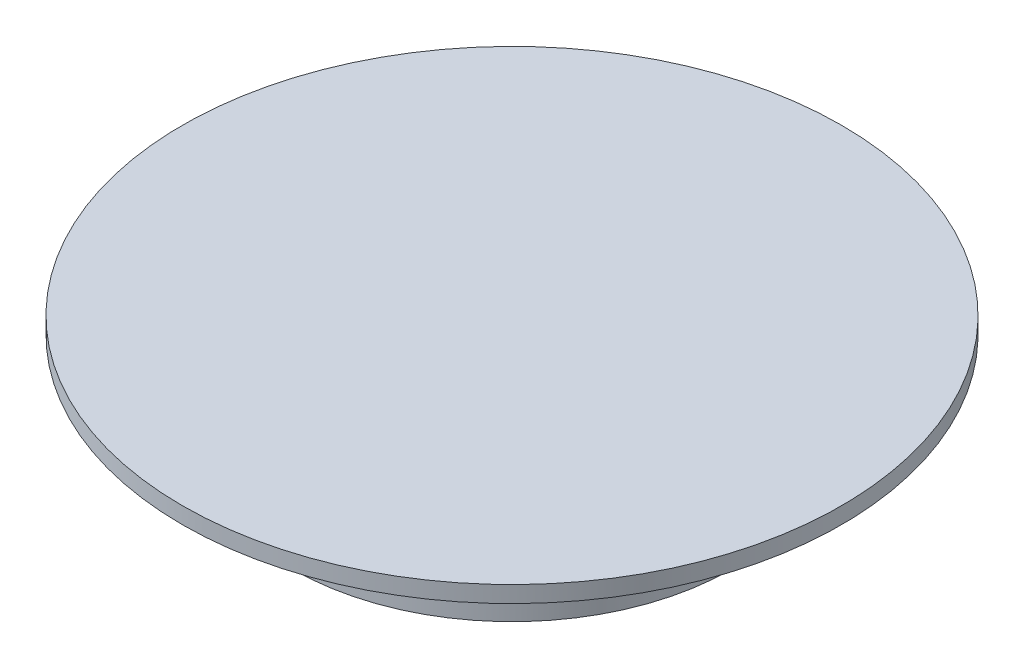
ISO-10303-21;
HEADER;
FILE_DESCRIPTION(('STEP AP214'),'2;1');
FILE_NAME('part.step','',(''),(''),'','','');
FILE_SCHEMA(('AUTOMOTIVE_DESIGN { 1 0 10303 214 1 1 1 1 }'));
ENDSEC;
DATA;
#1=APPLICATION_CONTEXT('core data for automotive mechanical design processes');
#2=APPLICATION_PROTOCOL_DEFINITION('international standard','automotive_design',2000,#1);
#3=PRODUCT_CONTEXT('',#1,'mechanical');
#4=PRODUCT('Part','Part','',(#3));
#5=PRODUCT_RELATED_PRODUCT_CATEGORY('part','',(#4));
#6=PRODUCT_DEFINITION_FORMATION('','',#4);
#7=PRODUCT_DEFINITION_CONTEXT('part definition',#1,'design');
#8=PRODUCT_DEFINITION('design','',#6,#7);
#9=PRODUCT_DEFINITION_SHAPE('','',#8);
#10=(LENGTH_UNIT() NAMED_UNIT(*) SI_UNIT(.MILLI.,.METRE.));
#11=(NAMED_UNIT(*) PLANE_ANGLE_UNIT() SI_UNIT($,.RADIAN.));
#12=(NAMED_UNIT(*) SI_UNIT($,.STERADIAN.) SOLID_ANGLE_UNIT());
#13=UNCERTAINTY_MEASURE_WITH_UNIT(LENGTH_MEASURE(1.E-05),#10,'distance_accuracy_value','');
#14=(GEOMETRIC_REPRESENTATION_CONTEXT(3) GLOBAL_UNCERTAINTY_ASSIGNED_CONTEXT((#13)) GLOBAL_UNIT_ASSIGNED_CONTEXT((#10,
#11,#12)) REPRESENTATION_CONTEXT('',''));
#15=CARTESIAN_POINT('',(0.,0.,0.));
#16=DIRECTION('',(0.,0.,1.));
#17=DIRECTION('',(1.,0.,0.));
#18=AXIS2_PLACEMENT_3D('',#15,#16,#17);
#19=CARTESIAN_POINT('',(-60.,17.,0.));
#20=DIRECTION('',(0.,1.,0.));
#21=DIRECTION('',(0.,0.,1.));
#22=AXIS2_PLACEMENT_3D('',#19,#20,#21);
#23=PLANE('',#22);
#24=CARTESIAN_POINT('',(0.,17.,0.));
#25=DIRECTION('',(0.,1.,0.));
#26=DIRECTION('',(0.,0.,1.));
#27=AXIS2_PLACEMENT_3D('',#24,#25,#26);
#28=CIRCLE('',#27,43.);
#29=CARTESIAN_POINT('',(0.,17.,43.));
#30=VERTEX_POINT('',#29);
#31=EDGE_CURVE('E10',#30,#30,#28,.T.);
#32=ORIENTED_EDGE('',*,*,#31,.T.);
#33=EDGE_LOOP('',(#32));
#34=FACE_BOUND('',#33,.T.);
#35=CARTESIAN_POINT('',(0.,17.,0.));
#36=DIRECTION('',(0.,-1.,0.));
#37=DIRECTION('',(0.,0.,-1.));
#38=AXIS2_PLACEMENT_3D('',#35,#36,#37);
#39=CIRCLE('',#38,60.);
#40=CARTESIAN_POINT('',(0.,17.,-60.));
#41=VERTEX_POINT('',#40);
#42=EDGE_CURVE('E76',#41,#41,#39,.T.);
#43=ORIENTED_EDGE('',*,*,#42,.T.);
#44=EDGE_LOOP('',(#43));
#45=FACE_BOUND('',#44,.T.);
#46=ADVANCED_FACE('F42',(#34,#45),#23,.F.);
#47=CARTESIAN_POINT('',(0.,-63.9534883720931,0.));
#48=DIRECTION('',(0.,-1.,0.));
#49=DIRECTION('',(0.,0.,-1.));
#50=AXIS2_PLACEMENT_3D('',#47,#48,#49);
#51=CYLINDRICAL_SURFACE('',#50,40.);
#52=CARTESIAN_POINT('',(0.,14.,0.));
#53=DIRECTION('',(0.,1.,0.));
#54=DIRECTION('',(0.,0.,1.));
#55=AXIS2_PLACEMENT_3D('',#52,#53,#54);
#56=CIRCLE('',#55,40.);
#57=CARTESIAN_POINT('',(0.,14.,40.));
#58=VERTEX_POINT('',#57);
#59=EDGE_CURVE('E50',#58,#58,#56,.F.);
#60=ORIENTED_EDGE('',*,*,#59,.T.);
#61=EDGE_LOOP('',(#60));
#62=FACE_BOUND('',#61,.T.);
#63=CARTESIAN_POINT('',(0.,0.,0.));
#64=DIRECTION('',(0.,-1.,0.));
#65=DIRECTION('',(0.,0.,-1.));
#66=AXIS2_PLACEMENT_3D('',#63,#64,#65);
#67=CIRCLE('',#66,40.);
#68=CARTESIAN_POINT('',(0.,0.,-40.));
#69=VERTEX_POINT('',#68);
#70=EDGE_CURVE('E56',#69,#69,#67,.T.);
#71=ORIENTED_EDGE('',*,*,#70,.F.);
#72=EDGE_LOOP('',(#71));
#73=FACE_BOUND('',#72,.T.);
#74=ADVANCED_FACE('F100',(#62,#73),#51,.T.);
#75=CARTESIAN_POINT('',(-35.,0.,0.));
#76=DIRECTION('',(0.,1.,0.));
#77=DIRECTION('',(0.,0.,1.));
#78=AXIS2_PLACEMENT_3D('',#75,#76,#77);
#79=PLANE('',#78);
#80=CARTESIAN_POINT('',(0.,0.,0.));
#81=DIRECTION('',(0.,-1.,0.));
#82=DIRECTION('',(0.,0.,-1.));
#83=AXIS2_PLACEMENT_3D('',#80,#81,#82);
#84=CIRCLE('',#83,35.);
#85=CARTESIAN_POINT('',(0.,0.,-35.));
#86=VERTEX_POINT('',#85);
#87=EDGE_CURVE('E62',#86,#86,#84,.T.);
#88=ORIENTED_EDGE('',*,*,#87,.F.);
#89=EDGE_LOOP('',(#88));
#90=FACE_BOUND('',#89,.T.);
#91=ORIENTED_EDGE('',*,*,#70,.T.);
#92=EDGE_LOOP('',(#91));
#93=FACE_BOUND('',#92,.T.);
#94=ADVANCED_FACE('F104',(#90,#93),#79,.F.);
#95=CARTESIAN_POINT('',(0.,-63.9534883720931,0.));
#96=DIRECTION('',(0.,-1.,0.));
#97=DIRECTION('',(0.,0.,-1.));
#98=AXIS2_PLACEMENT_3D('',#95,#96,#97);
#99=CYLINDRICAL_SURFACE('',#98,35.);
#100=CARTESIAN_POINT('',(0.,17.,0.));
#101=DIRECTION('',(0.,-1.,0.));
#102=DIRECTION('',(0.,0.,-1.));
#103=AXIS2_PLACEMENT_3D('',#100,#101,#102);
#104=CIRCLE('',#103,35.);
#105=CARTESIAN_POINT('',(0.,17.,-35.));
#106=VERTEX_POINT('',#105);
#107=EDGE_CURVE('E68',#106,#106,#104,.T.);
#108=ORIENTED_EDGE('',*,*,#107,.F.);
#109=EDGE_LOOP('',(#108));
#110=FACE_BOUND('',#109,.T.);
#111=ORIENTED_EDGE('',*,*,#87,.T.);
#112=EDGE_LOOP('',(#111));
#113=FACE_BOUND('',#112,.T.);
#114=ADVANCED_FACE('F96',(#110,#113),#99,.F.);
#115=CARTESIAN_POINT('',(0.,17.,0.));
#116=DIRECTION('',(0.,1.,0.));
#117=DIRECTION('',(0.,0.,1.));
#118=AXIS2_PLACEMENT_3D('',#115,#116,#117);
#119=PLANE('',#118);
#120=ORIENTED_EDGE('',*,*,#107,.T.);
#121=EDGE_LOOP('',(#120));
#122=FACE_BOUND('',#121,.T.);
#123=ADVANCED_FACE('F91',(#122),#119,.F.);
#124=CARTESIAN_POINT('',(-40.,20.,0.));
#125=DIRECTION('',(0.,-1.,0.));
#126=DIRECTION('',(0.,0.,-1.));
#127=AXIS2_PLACEMENT_3D('',#124,#125,#126);
#128=PLANE('',#127);
#129=CARTESIAN_POINT('',(0.,20.,0.));
#130=DIRECTION('',(0.,-1.,0.));
#131=DIRECTION('',(0.,0.,-1.));
#132=AXIS2_PLACEMENT_3D('',#129,#130,#131);
#133=CIRCLE('',#132,60.);
#134=CARTESIAN_POINT('',(0.,20.,-60.));
#135=VERTEX_POINT('',#134);
#136=EDGE_CURVE('E72',#135,#135,#133,.T.);
#137=ORIENTED_EDGE('',*,*,#136,.F.);
#138=EDGE_LOOP('',(#137));
#139=FACE_BOUND('',#138,.T.);
#140=ADVANCED_FACE('F86',(#139),#128,.F.);
#141=CARTESIAN_POINT('',(0.,-63.9534883720931,0.));
#142=DIRECTION('',(0.,-1.,0.));
#143=DIRECTION('',(0.,0.,-1.));
#144=AXIS2_PLACEMENT_3D('',#141,#142,#143);
#145=CYLINDRICAL_SURFACE('',#144,60.);
#146=ORIENTED_EDGE('',*,*,#42,.F.);
#147=EDGE_LOOP('',(#146));
#148=FACE_BOUND('',#147,.T.);
#149=ORIENTED_EDGE('',*,*,#136,.T.);
#150=EDGE_LOOP('',(#149));
#151=FACE_BOUND('',#150,.T.);
#152=ADVANCED_FACE('F83',(#148,#151),#145,.T.);
#153=CARTESIAN_POINT('',(0.,14.,0.));
#154=DIRECTION('',(0.,1.,0.));
#155=DIRECTION('',(0.,0.,1.));
#156=AXIS2_PLACEMENT_3D('',#153,#154,#155);
#157=TOROIDAL_SURFACE('',#156,43.,3.);
#158=ORIENTED_EDGE('',*,*,#31,.F.);
#159=EDGE_LOOP('',(#158));
#160=FACE_BOUND('',#159,.T.);
#161=ORIENTED_EDGE('',*,*,#59,.F.);
#162=EDGE_LOOP('',(#161));
#163=FACE_BOUND('',#162,.T.);
#164=ADVANCED_FACE('F44',(#160,#163),#157,.F.);
#165=CLOSED_SHELL('',(#46,#74,#94,#114,#123,#140,#152,#164));
#166=MANIFOLD_SOLID_BREP('B2',#165);
#167=ADVANCED_BREP_SHAPE_REPRESENTATION('',(#18,#166),#14);
#168=SHAPE_DEFINITION_REPRESENTATION(#9,#167);
ENDSEC;
END-ISO-10303-21;
